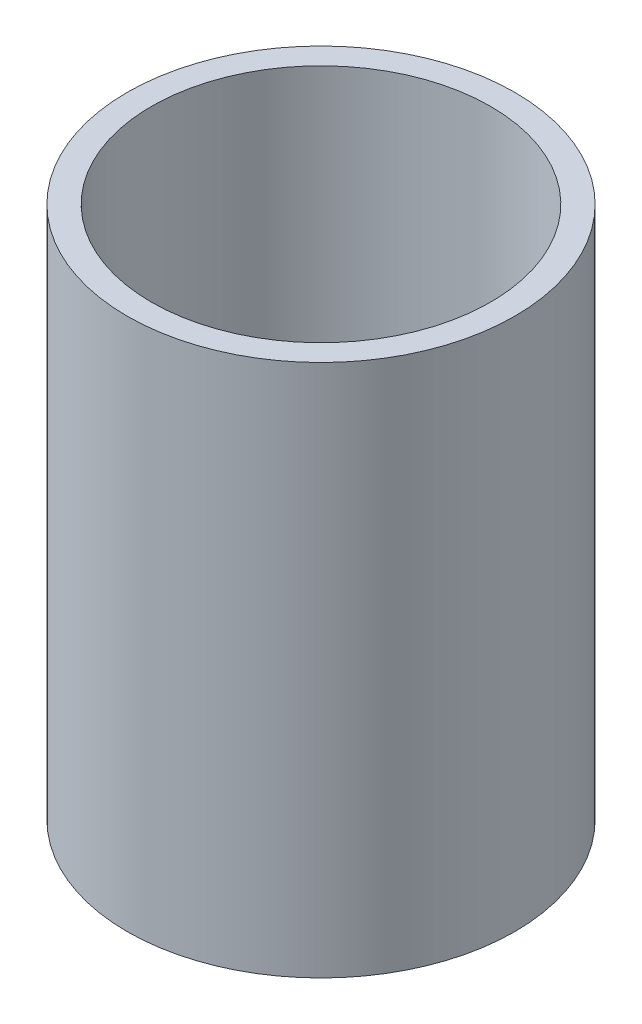
ISO-10303-21;
HEADER;
FILE_DESCRIPTION(('STEP AP214'),'2;1');
FILE_NAME('part.step','',(''),(''),'','','');
FILE_SCHEMA(('AUTOMOTIVE_DESIGN { 1 0 10303 214 1 1 1 1 }'));
ENDSEC;
DATA;
#1=APPLICATION_CONTEXT('core data for automotive mechanical design processes');
#2=APPLICATION_PROTOCOL_DEFINITION('international standard','automotive_design',2000,#1);
#3=PRODUCT_CONTEXT('',#1,'mechanical');
#4=PRODUCT('Part','Part','',(#3));
#5=PRODUCT_RELATED_PRODUCT_CATEGORY('part','',(#4));
#6=PRODUCT_DEFINITION_FORMATION('','',#4);
#7=PRODUCT_DEFINITION_CONTEXT('part definition',#1,'design');
#8=PRODUCT_DEFINITION('design','',#6,#7);
#9=PRODUCT_DEFINITION_SHAPE('','',#8);
#10=(LENGTH_UNIT() NAMED_UNIT(*) SI_UNIT(.MILLI.,.METRE.));
#11=(NAMED_UNIT(*) PLANE_ANGLE_UNIT() SI_UNIT($,.RADIAN.));
#12=(NAMED_UNIT(*) SI_UNIT($,.STERADIAN.) SOLID_ANGLE_UNIT());
#13=UNCERTAINTY_MEASURE_WITH_UNIT(LENGTH_MEASURE(1.E-05),#10,'distance_accuracy_value','');
#14=(GEOMETRIC_REPRESENTATION_CONTEXT(3) GLOBAL_UNCERTAINTY_ASSIGNED_CONTEXT((#13)) GLOBAL_UNIT_ASSIGNED_CONTEXT((#10,
#11,#12)) REPRESENTATION_CONTEXT('',''));
#15=CARTESIAN_POINT('',(0.,0.,0.));
#16=DIRECTION('',(0.,0.,1.));
#17=DIRECTION('',(1.,0.,0.));
#18=AXIS2_PLACEMENT_3D('',#15,#16,#17);
#19=CARTESIAN_POINT('',(0.,110.,0.));
#20=DIRECTION('',(0.,1.,0.));
#21=DIRECTION('',(0.,0.,1.));
#22=AXIS2_PLACEMENT_3D('',#19,#20,#21);
#23=PLANE('',#22);
#24=CARTESIAN_POINT('',(0.,110.,0.));
#25=DIRECTION('',(0.,1.,0.));
#26=DIRECTION('',(0.,0.,1.));
#27=AXIS2_PLACEMENT_3D('',#24,#25,#26);
#28=CIRCLE('',#27,40.);
#29=CARTESIAN_POINT('',(0.,110.,40.));
#30=VERTEX_POINT('',#29);
#31=EDGE_CURVE('E10',#30,#30,#28,.T.);
#32=ORIENTED_EDGE('',*,*,#31,.T.);
#33=EDGE_LOOP('',(#32));
#34=FACE_BOUND('',#33,.T.);
#35=CARTESIAN_POINT('',(0.,110.,0.));
#36=DIRECTION('',(0.,1.,0.));
#37=DIRECTION('',(0.,0.,1.));
#38=AXIS2_PLACEMENT_3D('',#35,#36,#37);
#39=CIRCLE('',#38,35.);
#40=CARTESIAN_POINT('',(0.,110.,35.));
#41=VERTEX_POINT('',#40);
#42=EDGE_CURVE('E50',#41,#41,#39,.T.);
#43=ORIENTED_EDGE('',*,*,#42,.F.);
#44=EDGE_LOOP('',(#43));
#45=FACE_BOUND('',#44,.T.);
#46=ADVANCED_FACE('F37',(#34,#45),#23,.T.);
#47=CARTESIAN_POINT('',(0.,0.,0.));
#48=DIRECTION('',(0.,1.,0.));
#49=DIRECTION('',(0.,0.,1.));
#50=AXIS2_PLACEMENT_3D('',#47,#48,#49);
#51=PLANE('',#50);
#52=CARTESIAN_POINT('',(0.,0.,0.));
#53=DIRECTION('',(0.,1.,0.));
#54=DIRECTION('',(0.,0.,1.));
#55=AXIS2_PLACEMENT_3D('',#52,#53,#54);
#56=CIRCLE('',#55,40.);
#57=CARTESIAN_POINT('',(0.,0.,40.));
#58=VERTEX_POINT('',#57);
#59=EDGE_CURVE('E41',#58,#58,#56,.T.);
#60=ORIENTED_EDGE('',*,*,#59,.F.);
#61=EDGE_LOOP('',(#60));
#62=FACE_BOUND('',#61,.T.);
#63=CARTESIAN_POINT('',(0.,0.,0.));
#64=DIRECTION('',(0.,1.,0.));
#65=DIRECTION('',(0.,0.,1.));
#66=AXIS2_PLACEMENT_3D('',#63,#64,#65);
#67=CIRCLE('',#66,35.);
#68=CARTESIAN_POINT('',(0.,0.,35.));
#69=VERTEX_POINT('',#68);
#70=EDGE_CURVE('E52',#69,#69,#67,.T.);
#71=ORIENTED_EDGE('',*,*,#70,.T.);
#72=EDGE_LOOP('',(#71));
#73=FACE_BOUND('',#72,.T.);
#74=ADVANCED_FACE('F64',(#62,#73),#51,.F.);
#75=CARTESIAN_POINT('',(0.,110.,0.));
#76=DIRECTION('',(0.,-1.,0.));
#77=DIRECTION('',(0.,0.,-1.));
#78=AXIS2_PLACEMENT_3D('',#75,#76,#77);
#79=CYLINDRICAL_SURFACE('',#78,40.);
#80=ORIENTED_EDGE('',*,*,#31,.F.);
#81=EDGE_LOOP('',(#80));
#82=FACE_BOUND('',#81,.T.);
#83=ORIENTED_EDGE('',*,*,#59,.T.);
#84=EDGE_LOOP('',(#83));
#85=FACE_BOUND('',#84,.T.);
#86=ADVANCED_FACE('F39',(#82,#85),#79,.T.);
#87=CARTESIAN_POINT('',(0.,110.,0.));
#88=DIRECTION('',(0.,-1.,0.));
#89=DIRECTION('',(0.,0.,-1.));
#90=AXIS2_PLACEMENT_3D('',#87,#88,#89);
#91=CYLINDRICAL_SURFACE('',#90,35.);
#92=ORIENTED_EDGE('',*,*,#42,.T.);
#93=EDGE_LOOP('',(#92));
#94=FACE_BOUND('',#93,.T.);
#95=ORIENTED_EDGE('',*,*,#70,.F.);
#96=EDGE_LOOP('',(#95));
#97=FACE_BOUND('',#96,.T.);
#98=ADVANCED_FACE('F60',(#94,#97),#91,.F.);
#99=CLOSED_SHELL('',(#46,#74,#86,#98));
#100=MANIFOLD_SOLID_BREP('B2',#99);
#101=ADVANCED_BREP_SHAPE_REPRESENTATION('',(#18,#100),#14);
#102=SHAPE_DEFINITION_REPRESENTATION(#9,#101);
ENDSEC;
END-ISO-10303-21;
